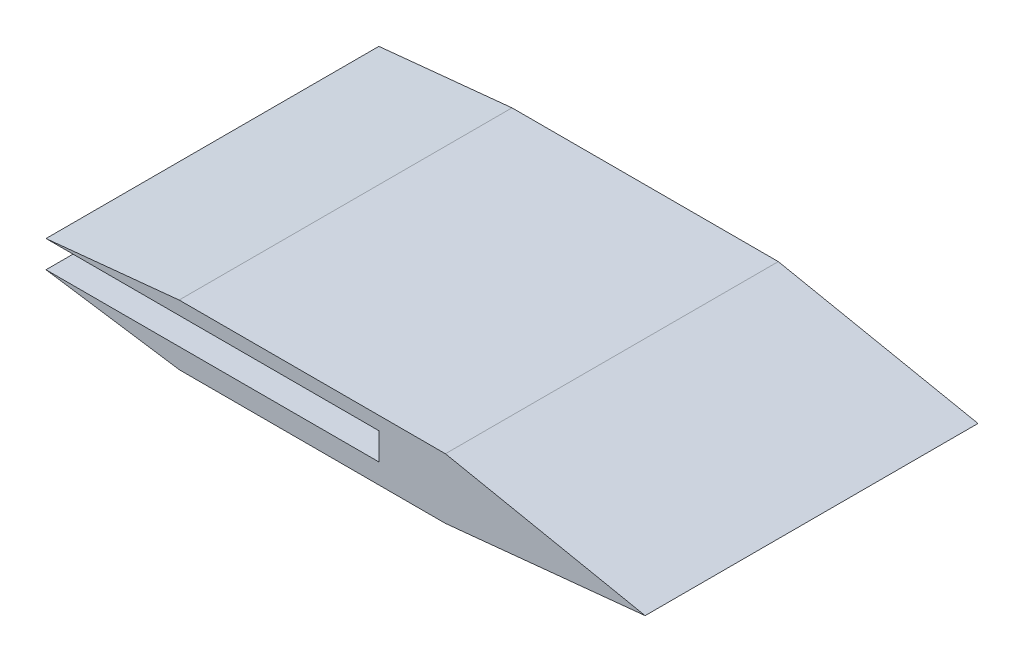
ISO-10303-21;
HEADER;
FILE_DESCRIPTION(('STEP AP214'),'2;1');
FILE_NAME('part.step','',(''),(''),'','','');
FILE_SCHEMA(('AUTOMOTIVE_DESIGN { 1 0 10303 214 1 1 1 1 }'));
ENDSEC;
DATA;
#1=APPLICATION_CONTEXT('core data for automotive mechanical design processes');
#2=APPLICATION_PROTOCOL_DEFINITION('international standard','automotive_design',2000,#1);
#3=PRODUCT_CONTEXT('',#1,'mechanical');
#4=PRODUCT('Part','Part','',(#3));
#5=PRODUCT_RELATED_PRODUCT_CATEGORY('part','',(#4));
#6=PRODUCT_DEFINITION_FORMATION('','',#4);
#7=PRODUCT_DEFINITION_CONTEXT('part definition',#1,'design');
#8=PRODUCT_DEFINITION('design','',#6,#7);
#9=PRODUCT_DEFINITION_SHAPE('','',#8);
#10=(LENGTH_UNIT() NAMED_UNIT(*) SI_UNIT(.MILLI.,.METRE.));
#11=(NAMED_UNIT(*) PLANE_ANGLE_UNIT() SI_UNIT($,.RADIAN.));
#12=(NAMED_UNIT(*) SI_UNIT($,.STERADIAN.) SOLID_ANGLE_UNIT());
#13=UNCERTAINTY_MEASURE_WITH_UNIT(LENGTH_MEASURE(1.E-05),#10,'distance_accuracy_value','');
#14=(GEOMETRIC_REPRESENTATION_CONTEXT(3) GLOBAL_UNCERTAINTY_ASSIGNED_CONTEXT((#13)) GLOBAL_UNIT_ASSIGNED_CONTEXT((#10,
#11,#12)) REPRESENTATION_CONTEXT('',''));
#15=CARTESIAN_POINT('',(0.,0.,0.));
#16=DIRECTION('',(0.,0.,1.));
#17=DIRECTION('',(1.,0.,0.));
#18=AXIS2_PLACEMENT_3D('',#15,#16,#17);
#19=CARTESIAN_POINT('',(50.,0.,50.));
#20=DIRECTION('',(0.,1.,0.));
#21=DIRECTION('',(-1.,0.,0.));
#22=AXIS2_PLACEMENT_3D('',#19,#20,#21);
#23=PLANE('',#22);
#24=DIRECTION('',(1.,0.,0.));
#25=VECTOR('',#24,1.);
#26=CARTESIAN_POINT('',(50.,0.,0.));
#27=LINE('',#26,#25);
#28=CARTESIAN_POINT('',(0.,0.,0.));
#29=VERTEX_POINT('',#28);
#30=CARTESIAN_POINT('',(50.,0.,0.));
#31=VERTEX_POINT('',#30);
#32=EDGE_CURVE('E135',#29,#31,#27,.T.);
#33=ORIENTED_EDGE('',*,*,#32,.T.);
#34=DIRECTION('',(0.,0.,-1.));
#35=VECTOR('',#34,1.);
#36=CARTESIAN_POINT('',(50.,0.,50.));
#37=LINE('',#36,#35);
#38=CARTESIAN_POINT('',(50.,0.,50.));
#39=VERTEX_POINT('',#38);
#40=EDGE_CURVE('E11',#39,#31,#37,.T.);
#41=ORIENTED_EDGE('',*,*,#40,.F.);
#42=DIRECTION('',(1.,0.,0.));
#43=VECTOR('',#42,1.);
#44=CARTESIAN_POINT('',(50.,0.,50.));
#45=LINE('',#44,#43);
#46=CARTESIAN_POINT('',(0.,0.,50.));
#47=VERTEX_POINT('',#46);
#48=EDGE_CURVE('E151',#47,#39,#45,.T.);
#49=ORIENTED_EDGE('',*,*,#48,.F.);
#50=DIRECTION('',(0.,0.,-1.));
#51=VECTOR('',#50,1.);
#52=CARTESIAN_POINT('',(0.,0.,50.));
#53=LINE('',#52,#51);
#54=EDGE_CURVE('E131',#47,#29,#53,.T.);
#55=ORIENTED_EDGE('',*,*,#54,.T.);
#56=EDGE_LOOP('',(#33,#41,#49,#55));
#57=FACE_BOUND('',#56,.T.);
#58=ADVANCED_FACE('F33',(#57),#23,.F.);
#59=CARTESIAN_POINT('',(50.,-4.06,50.));
#60=DIRECTION('',(1.,0.,0.));
#61=DIRECTION('',(0.,0.,-1.));
#62=AXIS2_PLACEMENT_3D('',#59,#60,#61);
#63=PLANE('',#62);
#64=DIRECTION('',(0.,-1.,0.));
#65=VECTOR('',#64,1.);
#66=CARTESIAN_POINT('',(50.,-4.06,0.));
#67=LINE('',#66,#65);
#68=CARTESIAN_POINT('',(50.,-4.06,0.));
#69=VERTEX_POINT('',#68);
#70=EDGE_CURVE('E138',#31,#69,#67,.T.);
#71=ORIENTED_EDGE('',*,*,#70,.T.);
#72=DIRECTION('',(0.,0.,-1.));
#73=VECTOR('',#72,1.);
#74=CARTESIAN_POINT('',(50.,-4.06,50.));
#75=LINE('',#74,#73);
#76=CARTESIAN_POINT('',(50.,-4.06,50.));
#77=VERTEX_POINT('',#76);
#78=EDGE_CURVE('E41',#77,#69,#75,.T.);
#79=ORIENTED_EDGE('',*,*,#78,.F.);
#80=DIRECTION('',(0.,-1.,0.));
#81=VECTOR('',#80,1.);
#82=CARTESIAN_POINT('',(50.,-4.06,50.));
#83=LINE('',#82,#81);
#84=EDGE_CURVE('E95',#39,#77,#83,.T.);
#85=ORIENTED_EDGE('',*,*,#84,.F.);
#86=ORIENTED_EDGE('',*,*,#40,.T.);
#87=EDGE_LOOP('',(#71,#79,#85,#86));
#88=FACE_BOUND('',#87,.T.);
#89=ADVANCED_FACE('F194',(#88),#63,.F.);
#90=CARTESIAN_POINT('',(0.,-4.06,50.));
#91=DIRECTION('',(0.,-1.,0.));
#92=DIRECTION('',(0.,0.,-1.));
#93=AXIS2_PLACEMENT_3D('',#90,#91,#92);
#94=PLANE('',#93);
#95=DIRECTION('',(-1.,0.,0.));
#96=VECTOR('',#95,1.);
#97=CARTESIAN_POINT('',(0.,-4.06,0.));
#98=LINE('',#97,#96);
#99=CARTESIAN_POINT('',(0.,-4.06,0.));
#100=VERTEX_POINT('',#99);
#101=EDGE_CURVE('E140',#69,#100,#98,.T.);
#102=ORIENTED_EDGE('',*,*,#101,.T.);
#103=DIRECTION('',(0.,0.,-1.));
#104=VECTOR('',#103,1.);
#105=CARTESIAN_POINT('',(0.,-4.06,50.));
#106=LINE('',#105,#104);
#107=CARTESIAN_POINT('',(0.,-4.06,50.));
#108=VERTEX_POINT('',#107);
#109=EDGE_CURVE('E161',#108,#100,#106,.T.);
#110=ORIENTED_EDGE('',*,*,#109,.F.);
#111=DIRECTION('',(-1.,0.,0.));
#112=VECTOR('',#111,1.);
#113=CARTESIAN_POINT('',(0.,-4.06,50.));
#114=LINE('',#113,#112);
#115=EDGE_CURVE('E169',#77,#108,#114,.T.);
#116=ORIENTED_EDGE('',*,*,#115,.F.);
#117=ORIENTED_EDGE('',*,*,#78,.T.);
#118=EDGE_LOOP('',(#102,#110,#116,#117));
#119=FACE_BOUND('',#118,.T.);
#120=ADVANCED_FACE('F167',(#119),#94,.F.);
#121=CARTESIAN_POINT('',(20.,-7.06,50.));
#122=DIRECTION('',(0.148340452930245,0.988936352868298,0.));
#123=DIRECTION('',(-0.988936352868298,0.148340452930245,0.));
#124=AXIS2_PLACEMENT_3D('',#121,#122,#123);
#125=PLANE('',#124);
#126=DIRECTION('',(0.988936352868298,-0.148340452930245,0.));
#127=VECTOR('',#126,1.);
#128=CARTESIAN_POINT('',(20.,-7.06,0.));
#129=LINE('',#128,#127);
#130=CARTESIAN_POINT('',(20.,-7.06,0.));
#131=VERTEX_POINT('',#130);
#132=EDGE_CURVE('E142',#100,#131,#129,.T.);
#133=ORIENTED_EDGE('',*,*,#132,.T.);
#134=DIRECTION('',(0.,0.,-1.));
#135=VECTOR('',#134,1.);
#136=CARTESIAN_POINT('',(20.,-7.06,50.));
#137=LINE('',#136,#135);
#138=CARTESIAN_POINT('',(20.,-7.06,50.));
#139=VERTEX_POINT('',#138);
#140=EDGE_CURVE('E158',#139,#131,#137,.T.);
#141=ORIENTED_EDGE('',*,*,#140,.F.);
#142=DIRECTION('',(0.988936352868298,-0.148340452930245,0.));
#143=VECTOR('',#142,1.);
#144=CARTESIAN_POINT('',(20.,-7.06,50.));
#145=LINE('',#144,#143);
#146=EDGE_CURVE('E185',#108,#139,#145,.T.);
#147=ORIENTED_EDGE('',*,*,#146,.F.);
#148=ORIENTED_EDGE('',*,*,#109,.T.);
#149=EDGE_LOOP('',(#133,#141,#147,#148));
#150=FACE_BOUND('',#149,.T.);
#151=ADVANCED_FACE('F178',(#150),#125,.F.);
#152=CARTESIAN_POINT('',(60.,-7.06,50.));
#153=DIRECTION('',(0.,1.,0.));
#154=DIRECTION('',(-1.,0.,0.));
#155=AXIS2_PLACEMENT_3D('',#152,#153,#154);
#156=PLANE('',#155);
#157=DIRECTION('',(1.,0.,0.));
#158=VECTOR('',#157,1.);
#159=CARTESIAN_POINT('',(60.,-7.06,0.));
#160=LINE('',#159,#158);
#161=CARTESIAN_POINT('',(60.,-7.06,0.));
#162=VERTEX_POINT('',#161);
#163=EDGE_CURVE('E144',#131,#162,#160,.T.);
#164=ORIENTED_EDGE('',*,*,#163,.T.);
#165=DIRECTION('',(0.,0.,-1.));
#166=VECTOR('',#165,1.);
#167=CARTESIAN_POINT('',(60.,-7.06,50.));
#168=LINE('',#167,#166);
#169=CARTESIAN_POINT('',(60.,-7.06,50.));
#170=VERTEX_POINT('',#169);
#171=EDGE_CURVE('E155',#170,#162,#168,.T.);
#172=ORIENTED_EDGE('',*,*,#171,.F.);
#173=DIRECTION('',(1.,0.,0.));
#174=VECTOR('',#173,1.);
#175=CARTESIAN_POINT('',(60.,-7.06,50.));
#176=LINE('',#175,#174);
#177=EDGE_CURVE('E184',#139,#170,#176,.T.);
#178=ORIENTED_EDGE('',*,*,#177,.F.);
#179=ORIENTED_EDGE('',*,*,#140,.T.);
#180=EDGE_LOOP('',(#164,#172,#178,#179));
#181=FACE_BOUND('',#180,.T.);
#182=ADVANCED_FACE('F182',(#181),#156,.F.);
#183=CARTESIAN_POINT('',(90.,-4.06,50.));
#184=DIRECTION('',(-0.0995037190209989,0.995037190209989,0.));
#185=DIRECTION('',(-0.995037190209989,-0.0995037190209989,0.));
#186=AXIS2_PLACEMENT_3D('',#183,#184,#185);
#187=PLANE('',#186);
#188=DIRECTION('',(0.995037190209989,0.0995037190209989,0.));
#189=VECTOR('',#188,1.);
#190=CARTESIAN_POINT('',(90.,-4.06,0.));
#191=LINE('',#190,#189);
#192=CARTESIAN_POINT('',(90.,-4.06,0.));
#193=VERTEX_POINT('',#192);
#194=EDGE_CURVE('E146',#162,#193,#191,.T.);
#195=ORIENTED_EDGE('',*,*,#194,.T.);
#196=DIRECTION('',(0.,0.,-1.));
#197=VECTOR('',#196,1.);
#198=CARTESIAN_POINT('',(90.,-4.06,50.));
#199=LINE('',#198,#197);
#200=CARTESIAN_POINT('',(90.,-4.06,50.));
#201=VERTEX_POINT('',#200);
#202=EDGE_CURVE('E126',#201,#193,#199,.T.);
#203=ORIENTED_EDGE('',*,*,#202,.F.);
#204=DIRECTION('',(0.995037190209989,0.0995037190209989,0.));
#205=VECTOR('',#204,1.);
#206=CARTESIAN_POINT('',(90.,-4.06,50.));
#207=LINE('',#206,#205);
#208=EDGE_CURVE('E117',#170,#201,#207,.T.);
#209=ORIENTED_EDGE('',*,*,#208,.F.);
#210=ORIENTED_EDGE('',*,*,#171,.T.);
#211=EDGE_LOOP('',(#195,#203,#209,#210));
#212=FACE_BOUND('',#211,.T.);
#213=ADVANCED_FACE('F206',(#212),#187,.F.);
#214=CARTESIAN_POINT('',(60.,2.,50.));
#215=DIRECTION('',(-0.198000776360217,-0.980201863169394,0.));
#216=DIRECTION('',(0.980201863169394,-0.198000776360217,0.));
#217=AXIS2_PLACEMENT_3D('',#214,#215,#216);
#218=PLANE('',#217);
#219=DIRECTION('',(-0.980201863169394,0.198000776360217,0.));
#220=VECTOR('',#219,1.);
#221=CARTESIAN_POINT('',(60.,2.,0.));
#222=LINE('',#221,#220);
#223=CARTESIAN_POINT('',(60.,2.,0.));
#224=VERTEX_POINT('',#223);
#225=EDGE_CURVE('E125',#193,#224,#222,.T.);
#226=ORIENTED_EDGE('',*,*,#225,.T.);
#227=DIRECTION('',(0.,0.,-1.));
#228=VECTOR('',#227,1.);
#229=CARTESIAN_POINT('',(60.,2.,50.));
#230=LINE('',#229,#228);
#231=CARTESIAN_POINT('',(60.,2.,50.));
#232=VERTEX_POINT('',#231);
#233=EDGE_CURVE('E122',#232,#224,#230,.T.);
#234=ORIENTED_EDGE('',*,*,#233,.F.);
#235=DIRECTION('',(-0.980201863169394,0.198000776360217,0.));
#236=VECTOR('',#235,1.);
#237=CARTESIAN_POINT('',(60.,2.,50.));
#238=LINE('',#237,#236);
#239=EDGE_CURVE('E111',#201,#232,#238,.T.);
#240=ORIENTED_EDGE('',*,*,#239,.F.);
#241=ORIENTED_EDGE('',*,*,#202,.T.);
#242=EDGE_LOOP('',(#226,#234,#240,#241));
#243=FACE_BOUND('',#242,.T.);
#244=ADVANCED_FACE('F123',(#243),#218,.F.);
#245=CARTESIAN_POINT('',(20.,2.,50.));
#246=DIRECTION('',(0.,-1.,0.));
#247=DIRECTION('',(0.,0.,-1.));
#248=AXIS2_PLACEMENT_3D('',#245,#246,#247);
#249=PLANE('',#248);
#250=DIRECTION('',(-1.,0.,0.));
#251=VECTOR('',#250,1.);
#252=CARTESIAN_POINT('',(20.,2.,0.));
#253=LINE('',#252,#251);
#254=CARTESIAN_POINT('',(20.,2.,0.));
#255=VERTEX_POINT('',#254);
#256=EDGE_CURVE('E81',#224,#255,#253,.T.);
#257=ORIENTED_EDGE('',*,*,#256,.T.);
#258=DIRECTION('',(0.,0.,-1.));
#259=VECTOR('',#258,1.);
#260=CARTESIAN_POINT('',(20.,2.,50.));
#261=LINE('',#260,#259);
#262=CARTESIAN_POINT('',(20.,2.,50.));
#263=VERTEX_POINT('',#262);
#264=EDGE_CURVE('E127',#263,#255,#261,.T.);
#265=ORIENTED_EDGE('',*,*,#264,.F.);
#266=DIRECTION('',(-1.,0.,0.));
#267=VECTOR('',#266,1.);
#268=CARTESIAN_POINT('',(20.,2.,50.));
#269=LINE('',#268,#267);
#270=EDGE_CURVE('E115',#232,#263,#269,.T.);
#271=ORIENTED_EDGE('',*,*,#270,.F.);
#272=ORIENTED_EDGE('',*,*,#233,.T.);
#273=EDGE_LOOP('',(#257,#265,#271,#272));
#274=FACE_BOUND('',#273,.T.);
#275=ADVANCED_FACE('F129',(#274),#249,.F.);
#276=CARTESIAN_POINT('',(0.,0.,50.));
#277=DIRECTION('',(0.0995037190209987,-0.995037190209989,0.));
#278=DIRECTION('',(0.995037190209989,0.0995037190209987,0.));
#279=AXIS2_PLACEMENT_3D('',#276,#277,#278);
#280=PLANE('',#279);
#281=DIRECTION('',(-0.995037190209989,-0.0995037190209987,0.));
#282=VECTOR('',#281,1.);
#283=CARTESIAN_POINT('',(0.,0.,0.));
#284=LINE('',#283,#282);
#285=EDGE_CURVE('E87',#255,#29,#284,.T.);
#286=ORIENTED_EDGE('',*,*,#285,.T.);
#287=ORIENTED_EDGE('',*,*,#54,.F.);
#288=DIRECTION('',(-0.995037190209989,-0.0995037190209987,0.));
#289=VECTOR('',#288,1.);
#290=CARTESIAN_POINT('',(0.,0.,50.));
#291=LINE('',#290,#289);
#292=EDGE_CURVE('E49',#263,#47,#291,.T.);
#293=ORIENTED_EDGE('',*,*,#292,.F.);
#294=ORIENTED_EDGE('',*,*,#264,.T.);
#295=EDGE_LOOP('',(#286,#287,#293,#294));
#296=FACE_BOUND('',#295,.T.);
#297=ADVANCED_FACE('F214',(#296),#280,.F.);
#298=CARTESIAN_POINT('',(0.,0.,50.));
#299=DIRECTION('',(0.,0.,-1.));
#300=DIRECTION('',(-1.,0.,0.));
#301=AXIS2_PLACEMENT_3D('',#298,#299,#300);
#302=PLANE('',#301);
#303=ORIENTED_EDGE('',*,*,#48,.T.);
#304=ORIENTED_EDGE('',*,*,#84,.T.);
#305=ORIENTED_EDGE('',*,*,#115,.T.);
#306=ORIENTED_EDGE('',*,*,#146,.T.);
#307=ORIENTED_EDGE('',*,*,#177,.T.);
#308=ORIENTED_EDGE('',*,*,#208,.T.);
#309=ORIENTED_EDGE('',*,*,#239,.T.);
#310=ORIENTED_EDGE('',*,*,#270,.T.);
#311=ORIENTED_EDGE('',*,*,#292,.T.);
#312=EDGE_LOOP('',(#303,#304,#305,#306,#307,#308,#309,#310,#311));
#313=FACE_BOUND('',#312,.T.);
#314=ADVANCED_FACE('F113',(#313),#302,.F.);
#315=CARTESIAN_POINT('',(0.,0.,0.));
#316=DIRECTION('',(0.,0.,-1.));
#317=DIRECTION('',(-1.,0.,0.));
#318=AXIS2_PLACEMENT_3D('',#315,#316,#317);
#319=PLANE('',#318);
#320=ORIENTED_EDGE('',*,*,#32,.F.);
#321=ORIENTED_EDGE('',*,*,#285,.F.);
#322=ORIENTED_EDGE('',*,*,#256,.F.);
#323=ORIENTED_EDGE('',*,*,#225,.F.);
#324=ORIENTED_EDGE('',*,*,#194,.F.);
#325=ORIENTED_EDGE('',*,*,#163,.F.);
#326=ORIENTED_EDGE('',*,*,#132,.F.);
#327=ORIENTED_EDGE('',*,*,#101,.F.);
#328=ORIENTED_EDGE('',*,*,#70,.F.);
#329=EDGE_LOOP('',(#320,#321,#322,#323,#324,#325,#326,#327,#328));
#330=FACE_BOUND('',#329,.T.);
#331=ADVANCED_FACE('F173',(#330),#319,.T.);
#332=CLOSED_SHELL('',(#58,#89,#120,#151,#182,#213,#244,#275,#297,#314,#331));
#333=MANIFOLD_SOLID_BREP('B2',#332);
#334=ADVANCED_BREP_SHAPE_REPRESENTATION('',(#18,#333),#14);
#335=SHAPE_DEFINITION_REPRESENTATION(#9,#334);
ENDSEC;
END-ISO-10303-21;
